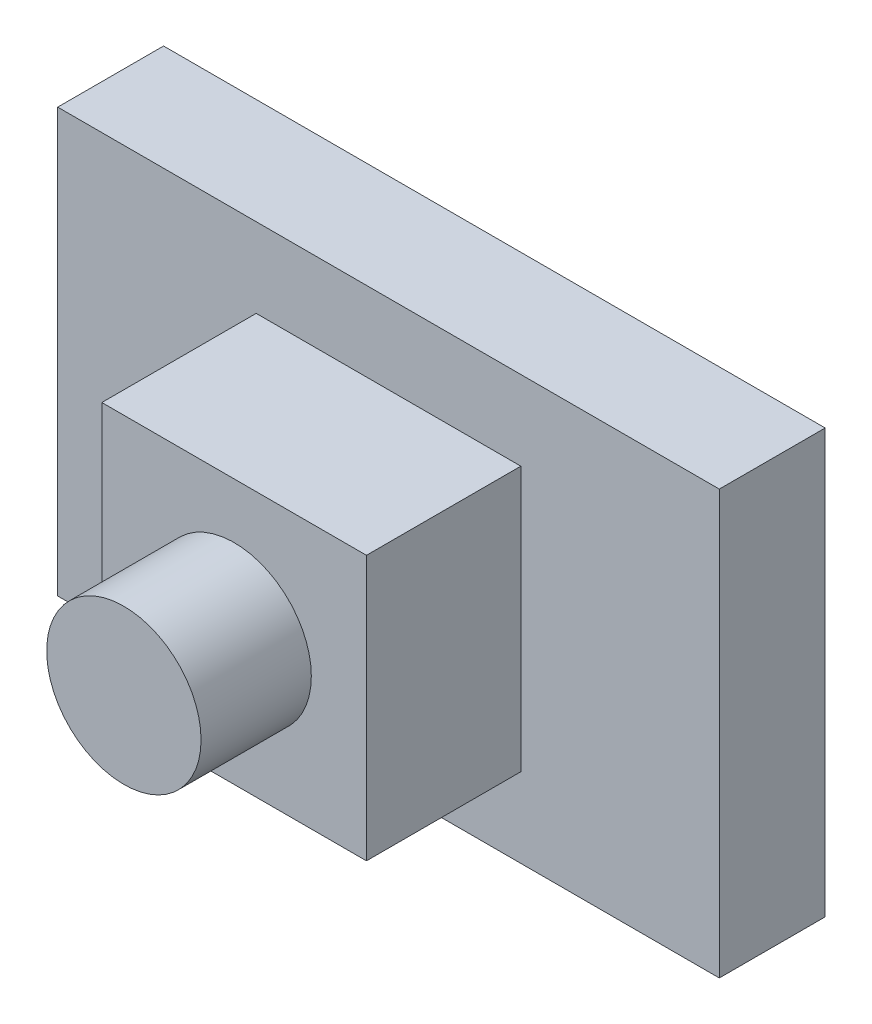
ISO-10303-21;
HEADER;
FILE_DESCRIPTION(('STEP AP214'),'2;1');
FILE_NAME('part.step','',(''),(''),'','','');
FILE_SCHEMA(('AUTOMOTIVE_DESIGN { 1 0 10303 214 1 1 1 1 }'));
ENDSEC;
DATA;
#1=APPLICATION_CONTEXT('core data for automotive mechanical design processes');
#2=APPLICATION_PROTOCOL_DEFINITION('international standard','automotive_design',2000,#1);
#3=PRODUCT_CONTEXT('',#1,'mechanical');
#4=PRODUCT('Part','Part','',(#3));
#5=PRODUCT_RELATED_PRODUCT_CATEGORY('part','',(#4));
#6=PRODUCT_DEFINITION_FORMATION('','',#4);
#7=PRODUCT_DEFINITION_CONTEXT('part definition',#1,'design');
#8=PRODUCT_DEFINITION('design','',#6,#7);
#9=PRODUCT_DEFINITION_SHAPE('','',#8);
#10=(LENGTH_UNIT() NAMED_UNIT(*) SI_UNIT(.MILLI.,.METRE.));
#11=(NAMED_UNIT(*) PLANE_ANGLE_UNIT() SI_UNIT($,.RADIAN.));
#12=(NAMED_UNIT(*) SI_UNIT($,.STERADIAN.) SOLID_ANGLE_UNIT());
#13=UNCERTAINTY_MEASURE_WITH_UNIT(LENGTH_MEASURE(1.E-05),#10,'distance_accuracy_value','');
#14=(GEOMETRIC_REPRESENTATION_CONTEXT(3) GLOBAL_UNCERTAINTY_ASSIGNED_CONTEXT((#13)) GLOBAL_UNIT_ASSIGNED_CONTEXT((#10,
#11,#12)) REPRESENTATION_CONTEXT('',''));
#15=CARTESIAN_POINT('',(0.,0.,0.));
#16=DIRECTION('',(0.,0.,1.));
#17=DIRECTION('',(1.,0.,0.));
#18=AXIS2_PLACEMENT_3D('',#15,#16,#17);
#19=CARTESIAN_POINT('',(0.,0.,2.4));
#20=DIRECTION('',(0.,0.,-1.));
#21=DIRECTION('',(-1.,0.,0.));
#22=AXIS2_PLACEMENT_3D('',#19,#20,#21);
#23=PLANE('',#22);
#24=DIRECTION('',(0.,1.,0.));
#25=VECTOR('',#24,1.);
#26=CARTESIAN_POINT('',(7.5,-4.8,2.4));
#27=LINE('',#26,#25);
#28=CARTESIAN_POINT('',(7.5,-4.8,2.4));
#29=VERTEX_POINT('',#28);
#30=CARTESIAN_POINT('',(7.5,4.8,2.4));
#31=VERTEX_POINT('',#30);
#32=EDGE_CURVE('E144',#29,#31,#27,.T.);
#33=ORIENTED_EDGE('',*,*,#32,.T.);
#34=DIRECTION('',(-1.,0.,0.));
#35=VECTOR('',#34,1.);
#36=CARTESIAN_POINT('',(-7.5,4.8,2.4));
#37=LINE('',#36,#35);
#38=CARTESIAN_POINT('',(-7.5,4.8,2.4));
#39=VERTEX_POINT('',#38);
#40=EDGE_CURVE('E148',#31,#39,#37,.T.);
#41=ORIENTED_EDGE('',*,*,#40,.T.);
#42=DIRECTION('',(0.,-1.,0.));
#43=VECTOR('',#42,1.);
#44=CARTESIAN_POINT('',(-7.5,-4.8,2.4));
#45=LINE('',#44,#43);
#46=CARTESIAN_POINT('',(-7.5,-4.8,2.4));
#47=VERTEX_POINT('',#46);
#48=EDGE_CURVE('E152',#39,#47,#45,.T.);
#49=ORIENTED_EDGE('',*,*,#48,.T.);
#50=DIRECTION('',(1.,0.,0.));
#51=VECTOR('',#50,1.);
#52=CARTESIAN_POINT('',(-7.5,-4.8,2.4));
#53=LINE('',#52,#51);
#54=EDGE_CURVE('E155',#47,#29,#53,.T.);
#55=ORIENTED_EDGE('',*,*,#54,.T.);
#56=EDGE_LOOP('',(#33,#41,#49,#55));
#57=FACE_BOUND('',#56,.T.);
#58=DIRECTION('',(0.,1.,0.));
#59=VECTOR('',#58,1.);
#60=CARTESIAN_POINT('',(3.,-3.,2.4));
#61=LINE('',#60,#59);
#62=CARTESIAN_POINT('',(3.,-3.,2.4));
#63=VERTEX_POINT('',#62);
#64=CARTESIAN_POINT('',(3.,3.,2.4));
#65=VERTEX_POINT('',#64);
#66=EDGE_CURVE('E60',#63,#65,#61,.T.);
#67=ORIENTED_EDGE('',*,*,#66,.F.);
#68=DIRECTION('',(1.,0.,0.));
#69=VECTOR('',#68,1.);
#70=CARTESIAN_POINT('',(-3.,-3.,2.4));
#71=LINE('',#70,#69);
#72=CARTESIAN_POINT('',(-3.,-3.,2.4));
#73=VERTEX_POINT('',#72);
#74=EDGE_CURVE('E64',#73,#63,#71,.T.);
#75=ORIENTED_EDGE('',*,*,#74,.F.);
#76=DIRECTION('',(0.,-1.,0.));
#77=VECTOR('',#76,1.);
#78=CARTESIAN_POINT('',(-3.,-3.,2.4));
#79=LINE('',#78,#77);
#80=CARTESIAN_POINT('',(-3.,3.,2.4));
#81=VERTEX_POINT('',#80);
#82=EDGE_CURVE('E350',#81,#73,#79,.T.);
#83=ORIENTED_EDGE('',*,*,#82,.F.);
#84=DIRECTION('',(-1.,0.,0.));
#85=VECTOR('',#84,1.);
#86=CARTESIAN_POINT('',(-3.,3.,2.4));
#87=LINE('',#86,#85);
#88=EDGE_CURVE('E340',#65,#81,#87,.T.);
#89=ORIENTED_EDGE('',*,*,#88,.F.);
#90=EDGE_LOOP('',(#67,#75,#83,#89));
#91=FACE_BOUND('',#90,.T.);
#92=ADVANCED_FACE('F43',(#57,#91),#23,.F.);
#93=CARTESIAN_POINT('',(7.5,-4.8,2.4));
#94=DIRECTION('',(-1.,0.,0.));
#95=DIRECTION('',(0.,0.,1.));
#96=AXIS2_PLACEMENT_3D('',#93,#94,#95);
#97=PLANE('',#96);
#98=DIRECTION('',(0.,1.,0.));
#99=VECTOR('',#98,1.);
#100=CARTESIAN_POINT('',(7.5,-4.8,0.));
#101=LINE('',#100,#99);
#102=CARTESIAN_POINT('',(7.5,-4.8,0.));
#103=VERTEX_POINT('',#102);
#104=CARTESIAN_POINT('',(7.5,4.8,0.));
#105=VERTEX_POINT('',#104);
#106=EDGE_CURVE('E133',#103,#105,#101,.T.);
#107=ORIENTED_EDGE('',*,*,#106,.T.);
#108=DIRECTION('',(0.,0.,-1.));
#109=VECTOR('',#108,1.);
#110=CARTESIAN_POINT('',(7.5,4.8,2.4));
#111=LINE('',#110,#109);
#112=EDGE_CURVE('E47',#31,#105,#111,.T.);
#113=ORIENTED_EDGE('',*,*,#112,.F.);
#114=ORIENTED_EDGE('',*,*,#32,.F.);
#115=DIRECTION('',(0.,0.,-1.));
#116=VECTOR('',#115,1.);
#117=CARTESIAN_POINT('',(7.5,-4.8,2.4));
#118=LINE('',#117,#116);
#119=EDGE_CURVE('E157',#29,#103,#118,.T.);
#120=ORIENTED_EDGE('',*,*,#119,.T.);
#121=EDGE_LOOP('',(#107,#113,#114,#120));
#122=FACE_BOUND('',#121,.T.);
#123=ADVANCED_FACE('F45',(#122),#97,.F.);
#124=CARTESIAN_POINT('',(-7.5,4.8,2.4));
#125=DIRECTION('',(0.,-1.,0.));
#126=DIRECTION('',(0.,0.,-1.));
#127=AXIS2_PLACEMENT_3D('',#124,#125,#126);
#128=PLANE('',#127);
#129=DIRECTION('',(-1.,0.,0.));
#130=VECTOR('',#129,1.);
#131=CARTESIAN_POINT('',(-7.5,4.8,0.));
#132=LINE('',#131,#130);
#133=CARTESIAN_POINT('',(-7.5,4.8,0.));
#134=VERTEX_POINT('',#133);
#135=EDGE_CURVE('E138',#105,#134,#132,.T.);
#136=ORIENTED_EDGE('',*,*,#135,.T.);
#137=DIRECTION('',(0.,0.,-1.));
#138=VECTOR('',#137,1.);
#139=CARTESIAN_POINT('',(-7.5,4.8,2.4));
#140=LINE('',#139,#138);
#141=EDGE_CURVE('E172',#39,#134,#140,.T.);
#142=ORIENTED_EDGE('',*,*,#141,.F.);
#143=ORIENTED_EDGE('',*,*,#40,.F.);
#144=ORIENTED_EDGE('',*,*,#112,.T.);
#145=EDGE_LOOP('',(#136,#142,#143,#144));
#146=FACE_BOUND('',#145,.T.);
#147=ADVANCED_FACE('F183',(#146),#128,.F.);
#148=CARTESIAN_POINT('',(-7.5,-4.8,2.4));
#149=DIRECTION('',(1.,0.,0.));
#150=DIRECTION('',(0.,0.,-1.));
#151=AXIS2_PLACEMENT_3D('',#148,#149,#150);
#152=PLANE('',#151);
#153=DIRECTION('',(0.,-1.,0.));
#154=VECTOR('',#153,1.);
#155=CARTESIAN_POINT('',(-7.5,-4.8,0.));
#156=LINE('',#155,#154);
#157=CARTESIAN_POINT('',(-7.5,-4.8,0.));
#158=VERTEX_POINT('',#157);
#159=EDGE_CURVE('E161',#134,#158,#156,.T.);
#160=ORIENTED_EDGE('',*,*,#159,.T.);
#161=DIRECTION('',(0.,0.,-1.));
#162=VECTOR('',#161,1.);
#163=CARTESIAN_POINT('',(-7.5,-4.8,2.4));
#164=LINE('',#163,#162);
#165=EDGE_CURVE('E169',#47,#158,#164,.T.);
#166=ORIENTED_EDGE('',*,*,#165,.F.);
#167=ORIENTED_EDGE('',*,*,#48,.F.);
#168=ORIENTED_EDGE('',*,*,#141,.T.);
#169=EDGE_LOOP('',(#160,#166,#167,#168));
#170=FACE_BOUND('',#169,.T.);
#171=ADVANCED_FACE('F192',(#170),#152,.F.);
#172=CARTESIAN_POINT('',(-7.5,-4.8,2.4));
#173=DIRECTION('',(0.,1.,0.));
#174=DIRECTION('',(0.,0.,1.));
#175=AXIS2_PLACEMENT_3D('',#172,#173,#174);
#176=PLANE('',#175);
#177=DIRECTION('',(1.,0.,0.));
#178=VECTOR('',#177,1.);
#179=CARTESIAN_POINT('',(-7.5,-4.8,0.));
#180=LINE('',#179,#178);
#181=EDGE_CURVE('E149',#158,#103,#180,.T.);
#182=ORIENTED_EDGE('',*,*,#181,.T.);
#183=ORIENTED_EDGE('',*,*,#119,.F.);
#184=ORIENTED_EDGE('',*,*,#54,.F.);
#185=ORIENTED_EDGE('',*,*,#165,.T.);
#186=EDGE_LOOP('',(#182,#183,#184,#185));
#187=FACE_BOUND('',#186,.T.);
#188=ADVANCED_FACE('F195',(#187),#176,.F.);
#189=CARTESIAN_POINT('',(0.,0.,0.));
#190=DIRECTION('',(0.,0.,-1.));
#191=DIRECTION('',(-1.,0.,0.));
#192=AXIS2_PLACEMENT_3D('',#189,#190,#191);
#193=PLANE('',#192);
#194=ORIENTED_EDGE('',*,*,#106,.F.);
#195=ORIENTED_EDGE('',*,*,#181,.F.);
#196=ORIENTED_EDGE('',*,*,#159,.F.);
#197=ORIENTED_EDGE('',*,*,#135,.F.);
#198=EDGE_LOOP('',(#194,#195,#196,#197));
#199=FACE_BOUND('',#198,.T.);
#200=ADVANCED_FACE('F190',(#199),#193,.T.);
#201=CARTESIAN_POINT('',(3.,-3.,5.9));
#202=DIRECTION('',(-1.,0.,0.));
#203=DIRECTION('',(0.,0.,1.));
#204=AXIS2_PLACEMENT_3D('',#201,#202,#203);
#205=PLANE('',#204);
#206=ORIENTED_EDGE('',*,*,#66,.T.);
#207=DIRECTION('',(0.,0.,-1.));
#208=VECTOR('',#207,1.);
#209=CARTESIAN_POINT('',(3.,3.,5.9));
#210=LINE('',#209,#208);
#211=CARTESIAN_POINT('',(3.,3.,5.9));
#212=VERTEX_POINT('',#211);
#213=EDGE_CURVE('E113',#212,#65,#210,.T.);
#214=ORIENTED_EDGE('',*,*,#213,.F.);
#215=DIRECTION('',(0.,1.,0.));
#216=VECTOR('',#215,1.);
#217=CARTESIAN_POINT('',(3.,-3.,5.9));
#218=LINE('',#217,#216);
#219=CARTESIAN_POINT('',(3.,-3.,5.9));
#220=VERTEX_POINT('',#219);
#221=EDGE_CURVE('E120',#220,#212,#218,.T.);
#222=ORIENTED_EDGE('',*,*,#221,.F.);
#223=DIRECTION('',(0.,0.,-1.));
#224=VECTOR('',#223,1.);
#225=CARTESIAN_POINT('',(3.,-3.,5.9));
#226=LINE('',#225,#224);
#227=EDGE_CURVE('E346',#220,#63,#226,.T.);
#228=ORIENTED_EDGE('',*,*,#227,.T.);
#229=EDGE_LOOP('',(#206,#214,#222,#228));
#230=FACE_BOUND('',#229,.T.);
#231=ADVANCED_FACE('F131',(#230),#205,.F.);
#232=CARTESIAN_POINT('',(-3.,3.,5.9));
#233=DIRECTION('',(0.,-1.,0.));
#234=DIRECTION('',(0.,0.,-1.));
#235=AXIS2_PLACEMENT_3D('',#232,#233,#234);
#236=PLANE('',#235);
#237=ORIENTED_EDGE('',*,*,#88,.T.);
#238=DIRECTION('',(0.,0.,-1.));
#239=VECTOR('',#238,1.);
#240=CARTESIAN_POINT('',(-3.,3.,5.9));
#241=LINE('',#240,#239);
#242=CARTESIAN_POINT('',(-3.,3.,5.9));
#243=VERTEX_POINT('',#242);
#244=EDGE_CURVE('E115',#243,#81,#241,.T.);
#245=ORIENTED_EDGE('',*,*,#244,.F.);
#246=DIRECTION('',(-1.,0.,0.));
#247=VECTOR('',#246,1.);
#248=CARTESIAN_POINT('',(-3.,3.,5.9));
#249=LINE('',#248,#247);
#250=EDGE_CURVE('E108',#212,#243,#249,.T.);
#251=ORIENTED_EDGE('',*,*,#250,.F.);
#252=ORIENTED_EDGE('',*,*,#213,.T.);
#253=EDGE_LOOP('',(#237,#245,#251,#252));
#254=FACE_BOUND('',#253,.T.);
#255=ADVANCED_FACE('F111',(#254),#236,.F.);
#256=CARTESIAN_POINT('',(-3.,-3.,5.9));
#257=DIRECTION('',(1.,0.,0.));
#258=DIRECTION('',(0.,0.,-1.));
#259=AXIS2_PLACEMENT_3D('',#256,#257,#258);
#260=PLANE('',#259);
#261=ORIENTED_EDGE('',*,*,#82,.T.);
#262=DIRECTION('',(0.,0.,-1.));
#263=VECTOR('',#262,1.);
#264=CARTESIAN_POINT('',(-3.,-3.,5.9));
#265=LINE('',#264,#263);
#266=CARTESIAN_POINT('',(-3.,-3.,5.9));
#267=VERTEX_POINT('',#266);
#268=EDGE_CURVE('E140',#267,#73,#265,.T.);
#269=ORIENTED_EDGE('',*,*,#268,.F.);
#270=DIRECTION('',(0.,-1.,0.));
#271=VECTOR('',#270,1.);
#272=CARTESIAN_POINT('',(-3.,-3.,5.9));
#273=LINE('',#272,#271);
#274=EDGE_CURVE('E119',#243,#267,#273,.T.);
#275=ORIENTED_EDGE('',*,*,#274,.F.);
#276=ORIENTED_EDGE('',*,*,#244,.T.);
#277=EDGE_LOOP('',(#261,#269,#275,#276));
#278=FACE_BOUND('',#277,.T.);
#279=ADVANCED_FACE('F238',(#278),#260,.F.);
#280=CARTESIAN_POINT('',(-3.,-3.,5.9));
#281=DIRECTION('',(0.,1.,0.));
#282=DIRECTION('',(0.,0.,1.));
#283=AXIS2_PLACEMENT_3D('',#280,#281,#282);
#284=PLANE('',#283);
#285=ORIENTED_EDGE('',*,*,#74,.T.);
#286=ORIENTED_EDGE('',*,*,#227,.F.);
#287=DIRECTION('',(1.,0.,0.));
#288=VECTOR('',#287,1.);
#289=CARTESIAN_POINT('',(-3.,-3.,5.9));
#290=LINE('',#289,#288);
#291=EDGE_CURVE('E125',#267,#220,#290,.T.);
#292=ORIENTED_EDGE('',*,*,#291,.F.);
#293=ORIENTED_EDGE('',*,*,#268,.T.);
#294=EDGE_LOOP('',(#285,#286,#292,#293));
#295=FACE_BOUND('',#294,.T.);
#296=ADVANCED_FACE('F244',(#295),#284,.F.);
#297=CARTESIAN_POINT('',(0.,0.,5.9));
#298=DIRECTION('',(0.,0.,-1.));
#299=DIRECTION('',(-1.,0.,0.));
#300=AXIS2_PLACEMENT_3D('',#297,#298,#299);
#301=PLANE('',#300);
#302=CARTESIAN_POINT('',(0.,0.,5.9));
#303=DIRECTION('',(0.,0.,1.));
#304=DIRECTION('',(1.,0.,0.));
#305=AXIS2_PLACEMENT_3D('',#302,#303,#304);
#306=CIRCLE('',#305,1.75);
#307=CARTESIAN_POINT('',(1.75,0.,5.9));
#308=VERTEX_POINT('',#307);
#309=EDGE_CURVE('E11',#308,#308,#306,.T.);
#310=ORIENTED_EDGE('',*,*,#309,.F.);
#311=EDGE_LOOP('',(#310));
#312=FACE_BOUND('',#311,.T.);
#313=ORIENTED_EDGE('',*,*,#221,.T.);
#314=ORIENTED_EDGE('',*,*,#250,.T.);
#315=ORIENTED_EDGE('',*,*,#274,.T.);
#316=ORIENTED_EDGE('',*,*,#291,.T.);
#317=EDGE_LOOP('',(#313,#314,#315,#316));
#318=FACE_BOUND('',#317,.T.);
#319=ADVANCED_FACE('F123',(#312,#318),#301,.F.);
#320=CARTESIAN_POINT('',(0.,0.,8.4));
#321=DIRECTION('',(0.,0.,-1.));
#322=DIRECTION('',(-1.,0.,0.));
#323=AXIS2_PLACEMENT_3D('',#320,#321,#322);
#324=CYLINDRICAL_SURFACE('',#323,1.75);
#325=CARTESIAN_POINT('',(0.,0.,8.4));
#326=DIRECTION('',(0.,0.,1.));
#327=DIRECTION('',(1.,0.,0.));
#328=AXIS2_PLACEMENT_3D('',#325,#326,#327);
#329=CIRCLE('',#328,1.75);
#330=CARTESIAN_POINT('',(1.75,0.,8.4));
#331=VERTEX_POINT('',#330);
#332=EDGE_CURVE('E336',#331,#331,#329,.T.);
#333=ORIENTED_EDGE('',*,*,#332,.F.);
#334=EDGE_LOOP('',(#333));
#335=FACE_BOUND('',#334,.T.);
#336=ORIENTED_EDGE('',*,*,#309,.T.);
#337=EDGE_LOOP('',(#336));
#338=FACE_BOUND('',#337,.T.);
#339=ADVANCED_FACE('F259',(#335,#338),#324,.T.);
#340=CARTESIAN_POINT('',(0.,0.,8.4));
#341=DIRECTION('',(0.,0.,1.));
#342=DIRECTION('',(1.,0.,0.));
#343=AXIS2_PLACEMENT_3D('',#340,#341,#342);
#344=PLANE('',#343);
#345=ORIENTED_EDGE('',*,*,#332,.T.);
#346=EDGE_LOOP('',(#345));
#347=FACE_BOUND('',#346,.T.);
#348=ADVANCED_FACE('F267',(#347),#344,.T.);
#349=CLOSED_SHELL('',(#92,#123,#147,#171,#188,#200,#231,#255,#279,#296,#319,#339,#348));
#350=MANIFOLD_SOLID_BREP('B2',#349);
#351=ADVANCED_BREP_SHAPE_REPRESENTATION('',(#18,#350),#14);
#352=SHAPE_DEFINITION_REPRESENTATION(#9,#351);
ENDSEC;
END-ISO-10303-21;
